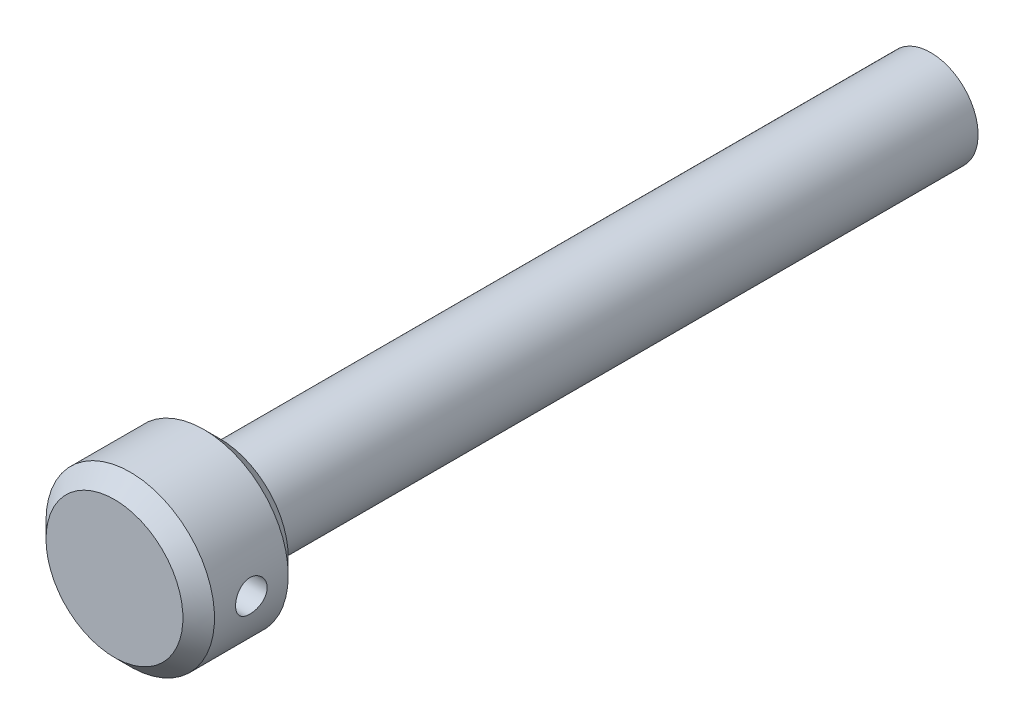
ISO-10303-21;
HEADER;
FILE_DESCRIPTION(('STEP AP214'),'2;1');
FILE_NAME('part.step','',(''),(''),'','','');
FILE_SCHEMA(('AUTOMOTIVE_DESIGN { 1 0 10303 214 1 1 1 1 }'));
ENDSEC;
DATA;
#1=APPLICATION_CONTEXT('core data for automotive mechanical design processes');
#2=APPLICATION_PROTOCOL_DEFINITION('international standard','automotive_design',2000,#1);
#3=PRODUCT_CONTEXT('',#1,'mechanical');
#4=PRODUCT('Part','Part','',(#3));
#5=PRODUCT_RELATED_PRODUCT_CATEGORY('part','',(#4));
#6=PRODUCT_DEFINITION_FORMATION('','',#4);
#7=PRODUCT_DEFINITION_CONTEXT('part definition',#1,'design');
#8=PRODUCT_DEFINITION('design','',#6,#7);
#9=PRODUCT_DEFINITION_SHAPE('','',#8);
#10=(LENGTH_UNIT() NAMED_UNIT(*) SI_UNIT(.MILLI.,.METRE.));
#11=(NAMED_UNIT(*) PLANE_ANGLE_UNIT() SI_UNIT($,.RADIAN.));
#12=(NAMED_UNIT(*) SI_UNIT($,.STERADIAN.) SOLID_ANGLE_UNIT());
#13=UNCERTAINTY_MEASURE_WITH_UNIT(LENGTH_MEASURE(1.E-05),#10,'distance_accuracy_value','');
#14=(GEOMETRIC_REPRESENTATION_CONTEXT(3) GLOBAL_UNCERTAINTY_ASSIGNED_CONTEXT((#13)) GLOBAL_UNIT_ASSIGNED_CONTEXT((#10,
#11,#12)) REPRESENTATION_CONTEXT('',''));
#15=CARTESIAN_POINT('',(0.,0.,0.));
#16=DIRECTION('',(0.,0.,1.));
#17=DIRECTION('',(1.,0.,0.));
#18=AXIS2_PLACEMENT_3D('',#15,#16,#17);
#19=CARTESIAN_POINT('',(-35.6874973721951,19.9803467794166,20.));
#20=DIRECTION('',(0.,0.,-1.));
#21=DIRECTION('',(-1.,0.,0.));
#22=AXIS2_PLACEMENT_3D('',#19,#20,#21);
#23=CYLINDRICAL_SURFACE('',#22,16.);
#24=CARTESIAN_POINT('',(-19.6874973721951,19.9803467794166,7.));
#25=CARTESIAN_POINT('',(-19.6875003955181,19.8134032864857,7.00000637917655));
#26=CARTESIAN_POINT('',(-19.6901371737608,19.6463767939564,7.01398215323876));
#27=CARTESIAN_POINT('',(-19.7004016543847,19.317030519733,7.06947999023669));
#28=CARTESIAN_POINT('',(-19.7080335688572,19.1547148311121,7.11102530127947));
#29=CARTESIAN_POINT('',(-19.7274345968859,18.839600855713,7.22034540251868));
#30=CARTESIAN_POINT('',(-19.7391999732654,18.6867941180459,7.28809650490509));
#31=CARTESIAN_POINT('',(-19.7655831601994,18.3947308332286,7.44783775384563));
#32=CARTESIAN_POINT('',(-19.7802007398293,18.255473190462,7.53982593828964));
#33=CARTESIAN_POINT('',(-19.810870643585,17.9927793475556,7.74659953600735));
#34=CARTESIAN_POINT('',(-19.8269366750681,17.8695288693529,7.86161888934027));
#35=CARTESIAN_POINT('',(-19.8585910030221,17.6439546567092,8.11068661817512));
#36=CARTESIAN_POINT('',(-19.8741792651046,17.5416324256318,8.24473635953857));
#37=CARTESIAN_POINT('',(-19.903246347295,17.3600468061007,8.52937217672794));
#38=CARTESIAN_POINT('',(-19.9167074944715,17.2809723400245,8.68008074063447));
#39=CARTESIAN_POINT('',(-19.9398031079554,17.1493362927709,8.99293783035358));
#40=CARTESIAN_POINT('',(-19.9494379042559,17.0967724251546,9.15508536822243));
#41=CARTESIAN_POINT('',(-19.9636519807041,17.0202457093466,9.48423046182882));
#42=CARTESIAN_POINT('',(-19.968288464867,16.9959589755758,9.65115019440693));
#43=CARTESIAN_POINT('',(-19.9721534291399,16.9756706175097,9.98675476961649));
#44=CARTESIAN_POINT('',(-19.9713823942199,16.9796664567091,10.1554394526046));
#45=CARTESIAN_POINT('',(-19.96457151816,17.0155671873693,10.4874390505321));
#46=CARTESIAN_POINT('',(-19.9586012092484,17.0471037794957,10.6507954286003));
#47=CARTESIAN_POINT('',(-19.9421737065018,17.1366107914925,10.9698568395652));
#48=CARTESIAN_POINT('',(-19.9317163220048,17.1945823346266,11.1255615470186));
#49=CARTESIAN_POINT('',(-19.9074202663433,17.3356738358306,11.4259773580005));
#50=CARTESIAN_POINT('',(-19.8935616957278,17.4189425087675,11.5706169411616));
#51=CARTESIAN_POINT('',(-19.8640379401367,17.6081594008083,11.8440094570805));
#52=CARTESIAN_POINT('',(-19.8483725718847,17.7141099216313,11.9727607754296));
#53=CARTESIAN_POINT('',(-19.8166973467518,17.9476686657106,12.2128499113449));
#54=CARTESIAN_POINT('',(-19.8006859517145,18.0755919056952,12.3238813049035));
#55=CARTESIAN_POINT('',(-19.7703496500287,18.3484107052189,12.5229544813508));
#56=CARTESIAN_POINT('',(-19.7560247602902,18.4933064349051,12.6109960337408));
#57=CARTESIAN_POINT('',(-19.7306465786449,18.7962768016673,12.76163550774));
#58=CARTESIAN_POINT('',(-19.7195973894693,18.9543676505236,12.8242015582358));
#59=CARTESIAN_POINT('',(-19.7020472641407,19.2790685486192,12.9218041861843));
#60=CARTESIAN_POINT('',(-19.6955458448352,19.445677690861,12.9568436880907));
#61=CARTESIAN_POINT('',(-19.6878901593555,19.7800494736098,12.9979720620365));
#62=CARTESIAN_POINT('',(-19.6866583539495,19.9477587541483,13.0044807830595));
#63=CARTESIAN_POINT('',(-19.6894665002305,20.281869275601,12.9894890409047));
#64=CARTESIAN_POINT('',(-19.6935061929065,20.4482705803774,12.9679899538695));
#65=CARTESIAN_POINT('',(-19.706355142187,20.773709925853,12.8979419296333));
#66=CARTESIAN_POINT('',(-19.7151269247145,20.9327953015087,12.8496054349244));
#67=CARTESIAN_POINT('',(-19.7364605279451,21.2406040430659,12.7274845864424));
#68=CARTESIAN_POINT('',(-19.7490226059684,21.3893267046068,12.6536985048684));
#69=CARTESIAN_POINT('',(-19.7767367650418,21.673980122443,12.481843743681));
#70=CARTESIAN_POINT('',(-19.7919156487038,21.8097533334468,12.3835185229263));
#71=CARTESIAN_POINT('',(-19.8231105024009,22.0630234259457,12.1657237252753));
#72=CARTESIAN_POINT('',(-19.8391265505014,22.1805185989383,12.0462521739973));
#73=CARTESIAN_POINT('',(-19.8704478582461,22.3954926968576,11.7876553621771));
#74=CARTESIAN_POINT('',(-19.88574085499,22.4926851037881,11.6482901837492));
#75=CARTESIAN_POINT('',(-19.9136376606245,22.6622802805723,11.3549647509525));
#76=CARTESIAN_POINT('',(-19.9262415694481,22.7346839716951,11.2010050392591));
#77=CARTESIAN_POINT('',(-19.9472368880036,22.8522402496731,10.8835882655149));
#78=CARTESIAN_POINT('',(-19.9556485634575,22.8975241553123,10.7201812408813));
#79=CARTESIAN_POINT('',(-19.9673532961468,22.9599603659413,10.3879055549572));
#80=CARTESIAN_POINT('',(-19.9706469308793,22.9771158448308,10.2190375120592));
#81=CARTESIAN_POINT('',(-19.971713376118,22.9827020223837,9.88350333711698));
#82=CARTESIAN_POINT('',(-19.9695730527092,22.9715846794866,9.71684483808601));
#83=CARTESIAN_POINT('',(-19.9602053589951,22.9219302869927,9.38781715590942));
#84=CARTESIAN_POINT('',(-19.9529780190802,22.8833934012032,9.22544794714512));
#85=CARTESIAN_POINT('',(-19.9342872117315,22.7801845310819,8.90985103040904));
#86=CARTESIAN_POINT('',(-19.9228316802958,22.7155614873616,8.75660681730847));
#87=CARTESIAN_POINT('',(-19.8969696211583,22.5620641576607,8.46306349151832));
#88=CARTESIAN_POINT('',(-19.8825628849927,22.4731881583803,8.32276529431044));
#89=CARTESIAN_POINT('',(-19.8521520500402,22.2721365262073,8.05683263991541));
#90=CARTESIAN_POINT('',(-19.8361272651342,22.1596319767027,7.9314491748658));
#91=CARTESIAN_POINT('',(-19.8044406938204,21.9152026329012,7.70118967507096));
#92=CARTESIAN_POINT('',(-19.7887789916485,21.7832733831998,7.59631835803973));
#93=CARTESIAN_POINT('',(-19.7594178528341,21.5023166695603,7.40917809474588));
#94=CARTESIAN_POINT('',(-19.7457373523839,21.3531459606976,7.32712114301872));
#95=CARTESIAN_POINT('',(-19.7220649845814,21.0429270067243,7.18936472678973));
#96=CARTESIAN_POINT('',(-19.7120696546144,20.8818900828271,7.13364050590619));
#97=CARTESIAN_POINT('',(-19.6989315580425,20.5970411850669,7.06144537116265));
#98=CARTESIAN_POINT('',(-19.694667954631,20.4748943999203,7.0384427393744));
#99=CARTESIAN_POINT('',(-19.6889497731149,20.2286292736469,7.00771787576711));
#100=CARTESIAN_POINT('',(-19.687495123599,20.104510982722,6.99999525548819));
#101=CARTESIAN_POINT('',(-19.6874973721951,19.9803467794166,7.));
#102=B_SPLINE_CURVE_WITH_KNOTS('',3,(#24,#25,#26,#27,#28,#29,#30,#31,#32,#33,#34,#35,#36,#37,
#38,#39,#40,#41,#42,#43,#44,#45,#46,#47,#48,#49,#50,#51,#52,#53,#54,#55,#56,#57,#58,#59,#60,#61,
#62,#63,#64,#65,#66,#67,#68,#69,#70,#71,#72,#73,#74,#75,#76,#77,#78,#79,#80,#81,#82,#83,#84,#85,
#86,#87,#88,#89,#90,#91,#92,#93,#94,#95,#96,#97,#98,#99,#100,#101),.UNSPECIFIED.,.T.,.F.,(4,2,2,
2,2,2,2,2,2,2,2,2,2,2,2,2,2,2,2,2,2,2,2,2,2,2,2,2,2,2,2,2,2,2,2,2,2,2,4),(0.,0.500376401929849,
1.0011752850709,1.50152254246181,2.00182930673781,2.5075023602726,3.01321172567233,
3.52292381008715,4.03259192623897,4.53636302890671,5.04008895174511,5.53718001225531,
6.03429219693573,6.53438525259061,7.03452908099718,7.54255536928153,8.05058675089895,
8.55925176643396,9.0678627334749,9.56896348152192,10.0700396092917,10.5672046781566,
11.0644035067606,11.5670355603542,12.069714568262,12.579068739746,13.0884039790989,
13.5952525563712,14.1020439389302,14.600785044635,15.0995231708301,15.5973299241538,
16.0951718531085,16.6004673993276,17.1058790252451,17.6158409783263,18.1253225386235,
18.4974868904882,18.8696417807908),.UNSPECIFIED.);
#103=CARTESIAN_POINT('',(-19.6874973721951,19.9803467794166,7.));
#104=VERTEX_POINT('',#103);
#105=EDGE_CURVE('E49',#104,#104,#102,.T.);
#106=ORIENTED_EDGE('',*,*,#105,.T.);
#107=EDGE_LOOP('',(#106));
#108=FACE_BOUND('',#107,.T.);
#109=CARTESIAN_POINT('',(-51.6874973721951,19.9803467794166,7.));
#110=CARTESIAN_POINT('',(-51.6874943488721,20.1472902723475,7.00000637917655));
#111=CARTESIAN_POINT('',(-51.6848575706294,20.3143167648768,7.01398215323876));
#112=CARTESIAN_POINT('',(-51.6745930900055,20.6436630391002,7.06947999023669));
#113=CARTESIAN_POINT('',(-51.666961175533,20.805978727721,7.11102530127947));
#114=CARTESIAN_POINT('',(-51.6475601475043,21.1210927031202,7.22034540251868));
#115=CARTESIAN_POINT('',(-51.6357947711248,21.2738994407873,7.28809650490509));
#116=CARTESIAN_POINT('',(-51.6094115841908,21.5659627256046,7.44783775384563));
#117=CARTESIAN_POINT('',(-51.5947940045609,21.7052203683712,7.53982593828963));
#118=CARTESIAN_POINT('',(-51.5641241008052,21.9679142112776,7.74659953600735));
#119=CARTESIAN_POINT('',(-51.5480580693221,22.0911646894803,7.86161888934027));
#120=CARTESIAN_POINT('',(-51.5164037413681,22.316738902124,8.11068661817512));
#121=CARTESIAN_POINT('',(-51.5008154792856,22.4190611332014,8.24473635953857));
#122=CARTESIAN_POINT('',(-51.4717483970952,22.6006467527325,8.52937217672794));
#123=CARTESIAN_POINT('',(-51.4582872499187,22.6797212188087,8.68008074063447));
#124=CARTESIAN_POINT('',(-51.4351916364348,22.8113572660623,8.99293783035358));
#125=CARTESIAN_POINT('',(-51.4255568401343,22.8639211336786,9.15508536822243));
#126=CARTESIAN_POINT('',(-51.4113427636861,22.9404478494866,9.48423046182882));
#127=CARTESIAN_POINT('',(-51.4067062795232,22.9647345832574,9.65115019440693));
#128=CARTESIAN_POINT('',(-51.4028413152503,22.9850229413235,9.98675476961649));
#129=CARTESIAN_POINT('',(-51.4036123501703,22.9810271021241,10.1554394526046));
#130=CARTESIAN_POINT('',(-51.4104232262302,22.9451263714638,10.4874390505321));
#131=CARTESIAN_POINT('',(-51.4163935351418,22.9135897793375,10.6507954286003));
#132=CARTESIAN_POINT('',(-51.4328210378884,22.8240827673407,10.9698568395652));
#133=CARTESIAN_POINT('',(-51.4432784223854,22.7661112242066,11.1255615470186));
#134=CARTESIAN_POINT('',(-51.4675744780469,22.6250197230026,11.4259773580005));
#135=CARTESIAN_POINT('',(-51.4814330486624,22.5417510500657,11.5706169411616));
#136=CARTESIAN_POINT('',(-51.5109568042535,22.3525341580249,11.8440094570805));
#137=CARTESIAN_POINT('',(-51.5266221725055,22.2465836372019,11.9727607754296));
#138=CARTESIAN_POINT('',(-51.5582973976384,22.0130248931226,12.2128499113449));
#139=CARTESIAN_POINT('',(-51.5743087926757,21.885101653138,12.3238813049035));
#140=CARTESIAN_POINT('',(-51.6046450943615,21.6122828536142,12.5229544813508));
#141=CARTESIAN_POINT('',(-51.6189699841,21.4673871239281,12.6109960337408));
#142=CARTESIAN_POINT('',(-51.6443481657453,21.1644167571659,12.76163550774));
#143=CARTESIAN_POINT('',(-51.6553973549209,21.0063259083096,12.8242015582358));
#144=CARTESIAN_POINT('',(-51.6729474802495,20.681625010214,12.9218041861843));
#145=CARTESIAN_POINT('',(-51.679448899555,20.5150158679722,12.9568436880907));
#146=CARTESIAN_POINT('',(-51.6871045850347,20.1806440852234,12.9979720620365));
#147=CARTESIAN_POINT('',(-51.6883363904407,20.0129348046849,13.0044807830595));
#148=CARTESIAN_POINT('',(-51.6855282441597,19.6788242832322,12.9894890409047));
#149=CARTESIAN_POINT('',(-51.6814885514837,19.5124229784558,12.9679899538695));
#150=CARTESIAN_POINT('',(-51.6686396022032,19.1869836329802,12.8979419296333));
#151=CARTESIAN_POINT('',(-51.6598678196757,19.0278982573245,12.8496054349244));
#152=CARTESIAN_POINT('',(-51.6385342164451,18.7200895157673,12.7274845864424));
#153=CARTESIAN_POINT('',(-51.6259721384218,18.5713668542264,12.6536985048684));
#154=CARTESIAN_POINT('',(-51.5982579793484,18.2867134363902,12.481843743681));
#155=CARTESIAN_POINT('',(-51.5830790956864,18.1509402253864,12.3835185229263));
#156=CARTESIAN_POINT('',(-51.5518842419893,17.8976701328875,12.1657237252753));
#157=CARTESIAN_POINT('',(-51.5358681938888,17.7801749598949,12.0462521739973));
#158=CARTESIAN_POINT('',(-51.5045468861441,17.5652008619756,11.7876553621771));
#159=CARTESIAN_POINT('',(-51.4892538894002,17.4680084550451,11.6482901837492));
#160=CARTESIAN_POINT('',(-51.4613570837657,17.2984132782609,11.3549647509525));
#161=CARTESIAN_POINT('',(-51.4487531749421,17.2260095871381,11.2010050392591));
#162=CARTESIAN_POINT('',(-51.4277578563866,17.1084533091601,10.8835882655149));
#163=CARTESIAN_POINT('',(-51.4193461809327,17.0631694035209,10.7201812408813));
#164=CARTESIAN_POINT('',(-51.4076414482434,17.0007331928919,10.3879055549572));
#165=CARTESIAN_POINT('',(-51.4043478135109,16.9835777140024,10.2190375120592));
#166=CARTESIAN_POINT('',(-51.4032813682722,16.9779915364495,9.88350333711698));
#167=CARTESIAN_POINT('',(-51.405421691681,16.9891088793466,9.71684483808601));
#168=CARTESIAN_POINT('',(-51.4147893853951,17.0387632718405,9.38781715590943));
#169=CARTESIAN_POINT('',(-51.42201672531,17.07730015763,9.22544794714512));
#170=CARTESIAN_POINT('',(-51.4407075326587,17.1805090277513,8.90985103040904));
#171=CARTESIAN_POINT('',(-51.4521630640944,17.2451320714715,8.75660681730847));
#172=CARTESIAN_POINT('',(-51.4780251232319,17.3986294011725,8.46306349151832));
#173=CARTESIAN_POINT('',(-51.4924318593975,17.4875054004529,8.32276529431044));
#174=CARTESIAN_POINT('',(-51.52284269435,17.6885570326259,8.05683263991542));
#175=CARTESIAN_POINT('',(-51.538867479256,17.8010615821305,7.9314491748658));
#176=CARTESIAN_POINT('',(-51.5705540505698,18.045490925932,7.70118967507096));
#177=CARTESIAN_POINT('',(-51.5862157527417,18.1774201756334,7.59631835803973));
#178=CARTESIAN_POINT('',(-51.6155768915561,18.4583768892728,7.40917809474588));
#179=CARTESIAN_POINT('',(-51.6292573920063,18.6075475981356,7.32712114301872));
#180=CARTESIAN_POINT('',(-51.6529297598088,18.9177665521089,7.18936472678973));
#181=CARTESIAN_POINT('',(-51.6629250897758,19.0788034760061,7.13364050590618));
#182=CARTESIAN_POINT('',(-51.6760631863477,19.3636523737663,7.06144537116265));
#183=CARTESIAN_POINT('',(-51.6803267897592,19.4857991589129,7.0384427393744));
#184=CARTESIAN_POINT('',(-51.6860449712753,19.7320642851863,7.00771787576711));
#185=CARTESIAN_POINT('',(-51.6874996207912,19.8561825761112,6.99999525548819));
#186=CARTESIAN_POINT('',(-51.6874973721951,19.9803467794166,7.));
#187=B_SPLINE_CURVE_WITH_KNOTS('',3,(#109,#110,#111,#112,#113,#114,#115,#116,#117,#118,#119,
#120,#121,#122,#123,#124,#125,#126,#127,#128,#129,#130,#131,#132,#133,#134,#135,#136,#137,#138,
#139,#140,#141,#142,#143,#144,#145,#146,#147,#148,#149,#150,#151,#152,#153,#154,#155,#156,#157,
#158,#159,#160,#161,#162,#163,#164,#165,#166,#167,#168,#169,#170,#171,#172,#173,#174,#175,#176,
#177,#178,#179,#180,#181,#182,#183,#184,#185,#186),.UNSPECIFIED.,.T.,.F.,(4,2,2,2,2,2,2,2,2,2,2,
2,2,2,2,2,2,2,2,2,2,2,2,2,2,2,2,2,2,2,2,2,2,2,2,2,2,2,4),(0.,0.500376401929849,1.0011752850709,
1.50152254246181,2.00182930673781,2.5075023602726,3.01321172567233,3.52292381008714,
4.03259192623896,4.53636302890671,5.04008895174511,5.5371800122553,6.03429219693572,
6.5343852525906,7.03452908099718,7.54255536928153,8.05058675089895,8.55925176643396,
9.0678627334749,9.56896348152192,10.0700396092917,10.5672046781566,11.0644035067606,
11.5670355603542,12.069714568262,12.579068739746,13.0884039790989,13.5952525563712,
14.1020439389302,14.600785044635,15.0995231708301,15.5973299241538,16.0951718531084,
16.6004673993276,17.1058790252451,17.6158409783263,18.1253225386235,18.4974868904882,
18.8696417807908),.UNSPECIFIED.);
#188=CARTESIAN_POINT('',(-51.6874973721951,19.9803467794166,7.));
#189=VERTEX_POINT('',#188);
#190=EDGE_CURVE('E10',#189,#189,#187,.T.);
#191=ORIENTED_EDGE('',*,*,#190,.T.);
#192=EDGE_LOOP('',(#191));
#193=FACE_BOUND('',#192,.T.);
#194=CARTESIAN_POINT('',(-35.6874973721951,19.9803467794166,3.00000000000001));
#195=DIRECTION('',(0.,0.,1.));
#196=DIRECTION('',(1.,0.,0.));
#197=AXIS2_PLACEMENT_3D('',#194,#195,#196);
#198=CIRCLE('',#197,16.);
#199=CARTESIAN_POINT('',(-19.6874973721951,19.9803467794166,3.00000000000001));
#200=VERTEX_POINT('',#199);
#201=EDGE_CURVE('E111',#200,#200,#198,.T.);
#202=ORIENTED_EDGE('',*,*,#201,.T.);
#203=EDGE_LOOP('',(#202));
#204=FACE_BOUND('',#203,.T.);
#205=CARTESIAN_POINT('',(-35.6874973721951,19.9803467794166,17.));
#206=DIRECTION('',(0.,0.,1.));
#207=DIRECTION('',(1.,0.,0.));
#208=AXIS2_PLACEMENT_3D('',#205,#206,#207);
#209=CIRCLE('',#208,16.);
#210=CARTESIAN_POINT('',(-51.6874973721951,19.9803467794166,17.));
#211=VERTEX_POINT('',#210);
#212=EDGE_CURVE('E114',#211,#211,#209,.F.);
#213=ORIENTED_EDGE('',*,*,#212,.T.);
#214=EDGE_LOOP('',(#213));
#215=FACE_BOUND('',#214,.T.);
#216=ADVANCED_FACE('F44',(#108,#193,#204,#215),#23,.T.);
#217=CARTESIAN_POINT('',(-35.6874973721951,19.9803467794166,20.));
#218=DIRECTION('',(0.,0.,1.));
#219=DIRECTION('',(1.,0.,0.));
#220=AXIS2_PLACEMENT_3D('',#217,#218,#219);
#221=PLANE('',#220);
#222=CARTESIAN_POINT('',(-35.6874973721951,19.9803467794166,20.));
#223=DIRECTION('',(0.,0.,1.));
#224=DIRECTION('',(1.,0.,0.));
#225=AXIS2_PLACEMENT_3D('',#222,#223,#224);
#226=CIRCLE('',#225,13.);
#227=CARTESIAN_POINT('',(-48.6874973721951,19.9803467794166,20.));
#228=VERTEX_POINT('',#227);
#229=EDGE_CURVE('E116',#228,#228,#226,.T.);
#230=ORIENTED_EDGE('',*,*,#229,.T.);
#231=EDGE_LOOP('',(#230));
#232=FACE_BOUND('',#231,.T.);
#233=ADVANCED_FACE('F87',(#232),#221,.T.);
#234=CARTESIAN_POINT('',(-35.6874973721951,19.9803467794166,0.));
#235=DIRECTION('',(0.,0.,1.));
#236=DIRECTION('',(1.,0.,0.));
#237=AXIS2_PLACEMENT_3D('',#234,#235,#236);
#238=PLANE('',#237);
#239=CARTESIAN_POINT('',(-35.6874973721951,19.9803467794166,0.));
#240=DIRECTION('',(0.,0.,-1.));
#241=DIRECTION('',(-1.,0.,0.));
#242=AXIS2_PLACEMENT_3D('',#239,#240,#241);
#243=CIRCLE('',#242,9.);
#244=CARTESIAN_POINT('',(-44.6874973721951,19.9803467794166,0.));
#245=VERTEX_POINT('',#244);
#246=EDGE_CURVE('E59',#245,#245,#243,.T.);
#247=ORIENTED_EDGE('',*,*,#246,.F.);
#248=EDGE_LOOP('',(#247));
#249=FACE_BOUND('',#248,.T.);
#250=CARTESIAN_POINT('',(-35.6874973721951,19.9803467794166,0.));
#251=DIRECTION('',(0.,0.,1.));
#252=DIRECTION('',(1.,0.,0.));
#253=AXIS2_PLACEMENT_3D('',#250,#251,#252);
#254=CIRCLE('',#253,13.);
#255=CARTESIAN_POINT('',(-22.6874973721951,19.9803467794166,0.));
#256=VERTEX_POINT('',#255);
#257=EDGE_CURVE('E64',#256,#256,#254,.F.);
#258=ORIENTED_EDGE('',*,*,#257,.T.);
#259=EDGE_LOOP('',(#258));
#260=FACE_BOUND('',#259,.T.);
#261=ADVANCED_FACE('F89',(#249,#260),#238,.F.);
#262=CARTESIAN_POINT('',(-35.6874973721951,19.9803467794166,20.));
#263=DIRECTION('',(0.,0.,-1.));
#264=DIRECTION('',(-1.,0.,0.));
#265=AXIS2_PLACEMENT_3D('',#262,#263,#264);
#266=CONICAL_SURFACE('',#265,13.,0.785398163397446);
#267=CARTESIAN_POINT('',(-51.6874973721951,19.9803467794166,17.));
#268=CARTESIAN_POINT('',(-51.6562473721951,19.9803467794166,17.03125));
#269=CARTESIAN_POINT('',(-51.6249973721951,19.9803467794166,17.0625));
#270=CARTESIAN_POINT('',(-51.5624973721951,19.9803467794166,17.125));
#271=CARTESIAN_POINT('',(-51.5312473721951,19.9803467794166,17.15625));
#272=CARTESIAN_POINT('',(-51.4687473721951,19.9803467794166,17.21875));
#273=CARTESIAN_POINT('',(-51.4374973721951,19.9803467794166,17.25));
#274=CARTESIAN_POINT('',(-51.3749973721951,19.9803467794166,17.3125));
#275=CARTESIAN_POINT('',(-51.3437473721951,19.9803467794166,17.34375));
#276=CARTESIAN_POINT('',(-51.2812473721951,19.9803467794166,17.40625));
#277=CARTESIAN_POINT('',(-51.2499973721951,19.9803467794166,17.4375));
#278=CARTESIAN_POINT('',(-51.1874973721951,19.9803467794166,17.5));
#279=CARTESIAN_POINT('',(-51.1562473721951,19.9803467794166,17.53125));
#280=CARTESIAN_POINT('',(-51.0937473721951,19.9803467794166,17.59375));
#281=CARTESIAN_POINT('',(-51.0624973721951,19.9803467794166,17.625));
#282=CARTESIAN_POINT('',(-50.9999973721951,19.9803467794166,17.6875));
#283=CARTESIAN_POINT('',(-50.9687473721951,19.9803467794166,17.71875));
#284=CARTESIAN_POINT('',(-50.9062473721951,19.9803467794166,17.78125));
#285=CARTESIAN_POINT('',(-50.8749973721951,19.9803467794166,17.8125));
#286=CARTESIAN_POINT('',(-50.8124973721951,19.9803467794166,17.875));
#287=CARTESIAN_POINT('',(-50.7812473721951,19.9803467794166,17.90625));
#288=CARTESIAN_POINT('',(-50.7187473721951,19.9803467794166,17.96875));
#289=CARTESIAN_POINT('',(-50.6874973721951,19.9803467794166,18.));
#290=CARTESIAN_POINT('',(-50.6249973721951,19.9803467794166,18.0625));
#291=CARTESIAN_POINT('',(-50.5937473721951,19.9803467794166,18.09375));
#292=CARTESIAN_POINT('',(-50.5312473721951,19.9803467794166,18.15625));
#293=CARTESIAN_POINT('',(-50.4999973721951,19.9803467794166,18.1875));
#294=CARTESIAN_POINT('',(-50.4374973721951,19.9803467794166,18.25));
#295=CARTESIAN_POINT('',(-50.4062473721951,19.9803467794166,18.28125));
#296=CARTESIAN_POINT('',(-50.3437473721951,19.9803467794166,18.34375));
#297=CARTESIAN_POINT('',(-50.3124973721951,19.9803467794166,18.375));
#298=CARTESIAN_POINT('',(-50.2499973721951,19.9803467794166,18.4375));
#299=CARTESIAN_POINT('',(-50.2187473721951,19.9803467794166,18.46875));
#300=CARTESIAN_POINT('',(-50.1562473721951,19.9803467794166,18.53125));
#301=CARTESIAN_POINT('',(-50.1249973721951,19.9803467794166,18.5625));
#302=CARTESIAN_POINT('',(-50.0624973721951,19.9803467794166,18.625));
#303=CARTESIAN_POINT('',(-50.0312473721951,19.9803467794166,18.65625));
#304=CARTESIAN_POINT('',(-49.9687473721951,19.9803467794166,18.71875));
#305=CARTESIAN_POINT('',(-49.9374973721951,19.9803467794166,18.75));
#306=CARTESIAN_POINT('',(-49.8749973721951,19.9803467794166,18.8125));
#307=CARTESIAN_POINT('',(-49.8437473721951,19.9803467794166,18.84375));
#308=CARTESIAN_POINT('',(-49.7812473721951,19.9803467794166,18.90625));
#309=CARTESIAN_POINT('',(-49.7499973721951,19.9803467794166,18.9375));
#310=CARTESIAN_POINT('',(-49.6874973721951,19.9803467794166,19.));
#311=CARTESIAN_POINT('',(-49.6562473721951,19.9803467794166,19.03125));
#312=CARTESIAN_POINT('',(-49.5937473721951,19.9803467794166,19.09375));
#313=CARTESIAN_POINT('',(-49.5624973721951,19.9803467794166,19.125));
#314=CARTESIAN_POINT('',(-49.4999973721951,19.9803467794166,19.1875));
#315=CARTESIAN_POINT('',(-49.4687473721951,19.9803467794166,19.21875));
#316=CARTESIAN_POINT('',(-49.4062473721951,19.9803467794166,19.28125));
#317=CARTESIAN_POINT('',(-49.3749973721951,19.9803467794166,19.3125));
#318=CARTESIAN_POINT('',(-49.3124973721951,19.9803467794166,19.375));
#319=CARTESIAN_POINT('',(-49.2812473721951,19.9803467794166,19.40625));
#320=CARTESIAN_POINT('',(-49.2187473721951,19.9803467794166,19.46875));
#321=CARTESIAN_POINT('',(-49.1874973721951,19.9803467794166,19.5));
#322=CARTESIAN_POINT('',(-49.1249973721951,19.9803467794166,19.5625));
#323=CARTESIAN_POINT('',(-49.0937473721951,19.9803467794166,19.59375));
#324=CARTESIAN_POINT('',(-49.0312473721951,19.9803467794166,19.65625));
#325=CARTESIAN_POINT('',(-48.9999973721951,19.9803467794166,19.6875));
#326=CARTESIAN_POINT('',(-48.9374973721951,19.9803467794166,19.75));
#327=CARTESIAN_POINT('',(-48.9062473721951,19.9803467794166,19.78125));
#328=CARTESIAN_POINT('',(-48.8437473721951,19.9803467794166,19.84375));
#329=CARTESIAN_POINT('',(-48.8124973721951,19.9803467794166,19.875));
#330=CARTESIAN_POINT('',(-48.7499973721951,19.9803467794166,19.9375));
#331=CARTESIAN_POINT('',(-48.7187473721951,19.9803467794166,19.96875));
#332=CARTESIAN_POINT('',(-48.6874973721951,19.9803467794166,20.));
#333=B_SPLINE_CURVE_WITH_KNOTS('',3,(#267,#268,#269,#270,#271,#272,#273,#274,#275,#276,#277,
#278,#279,#280,#281,#282,#283,#284,#285,#286,#287,#288,#289,#290,#291,#292,#293,#294,#295,#296,
#297,#298,#299,#300,#301,#302,#303,#304,#305,#306,#307,#308,#309,#310,#311,#312,#313,#314,#315,
#316,#317,#318,#319,#320,#321,#322,#323,#324,#325,#326,#327,#328,#329,#330,#331,#332),
.UNSPECIFIED.,.F.,.F.,(4,2,2,2,2,2,2,2,2,2,2,2,2,2,2,2,2,2,2,2,2,2,2,2,2,2,2,2,2,2,2,2,4),(0.,
0.132582521472475,0.265165042944958,0.397747564417436,0.530330085889913,0.662912607362389,
0.795495128834869,0.928077650307344,1.06066017177982,1.1932426932523,1.32582521472478,
1.45840773619726,1.59099025766973,1.72357277914221,1.85615530061469,1.98873782208717,
2.12132034355964,2.25390286503212,2.3864853865046,2.51906790797708,2.65165042944955,
2.78423295092203,2.91681547239451,3.04939799386698,3.18198051533946,3.31456303681194,
3.44714555828442,3.5797280797569,3.71231060122938,3.84489312270186,3.97747564417433,
4.11005816564681,4.24264068711929),.UNSPECIFIED.);
#334=EDGE_CURVE('BSEAM92',#211,#228,#333,.T.);
#335=ORIENTED_EDGE('',*,*,#212,.F.);
#336=ORIENTED_EDGE('',*,*,#229,.F.);
#337=ORIENTED_EDGE('',*,*,#334,.T.);
#338=ORIENTED_EDGE('',*,*,#334,.F.);
#339=EDGE_LOOP('',(#335,#337,#336,#338));
#340=FACE_BOUND('',#339,.T.);
#341=ADVANCED_FACE('F92',(#340),#266,.T.);
#342=CARTESIAN_POINT('',(-35.6874973721951,19.9803467794166,3.00000000000001));
#343=DIRECTION('',(0.,0.,1.));
#344=DIRECTION('',(1.,0.,0.));
#345=AXIS2_PLACEMENT_3D('',#342,#343,#344);
#346=CONICAL_SURFACE('',#345,16.,0.78539816339745);
#347=ORIENTED_EDGE('',*,*,#257,.F.);
#348=EDGE_LOOP('',(#347));
#349=FACE_BOUND('',#348,.T.);
#350=ORIENTED_EDGE('',*,*,#201,.F.);
#351=EDGE_LOOP('',(#350));
#352=FACE_BOUND('',#351,.T.);
#353=ADVANCED_FACE('F47',(#349,#352),#346,.T.);
#354=CARTESIAN_POINT('',(-35.6874973721951,19.9803467794166,-135.));
#355=DIRECTION('',(0.,0.,1.));
#356=DIRECTION('',(1.,0.,0.));
#357=AXIS2_PLACEMENT_3D('',#354,#355,#356);
#358=CYLINDRICAL_SURFACE('',#357,9.);
#359=CARTESIAN_POINT('',(-35.6874973721951,19.9803467794166,-135.));
#360=DIRECTION('',(0.,0.,-1.));
#361=DIRECTION('',(-1.,0.,0.));
#362=AXIS2_PLACEMENT_3D('',#359,#360,#361);
#363=CIRCLE('',#362,9.);
#364=CARTESIAN_POINT('',(-44.6874973721951,19.9803467794166,-135.));
#365=VERTEX_POINT('',#364);
#366=EDGE_CURVE('E121',#365,#365,#363,.T.);
#367=ORIENTED_EDGE('',*,*,#366,.F.);
#368=EDGE_LOOP('',(#367));
#369=FACE_BOUND('',#368,.T.);
#370=ORIENTED_EDGE('',*,*,#246,.T.);
#371=EDGE_LOOP('',(#370));
#372=FACE_BOUND('',#371,.T.);
#373=ADVANCED_FACE('F82',(#369,#372),#358,.T.);
#374=CARTESIAN_POINT('',(-35.6874973721951,19.9803467794166,-135.));
#375=DIRECTION('',(0.,0.,-1.));
#376=DIRECTION('',(-1.,0.,0.));
#377=AXIS2_PLACEMENT_3D('',#374,#375,#376);
#378=PLANE('',#377);
#379=ORIENTED_EDGE('',*,*,#366,.T.);
#380=EDGE_LOOP('',(#379));
#381=FACE_BOUND('',#380,.T.);
#382=ADVANCED_FACE('F77',(#381),#378,.T.);
#383=CARTESIAN_POINT('',(-51.6874973721951,19.9803467794166,10.));
#384=DIRECTION('',(1.,0.,0.));
#385=DIRECTION('',(0.,0.,-1.));
#386=AXIS2_PLACEMENT_3D('',#383,#384,#385);
#387=CYLINDRICAL_SURFACE('',#386,3.);
#388=ORIENTED_EDGE('',*,*,#105,.F.);
#389=EDGE_LOOP('',(#388));
#390=FACE_BOUND('',#389,.T.);
#391=ORIENTED_EDGE('',*,*,#190,.F.);
#392=EDGE_LOOP('',(#391));
#393=FACE_BOUND('',#392,.T.);
#394=ADVANCED_FACE('F73',(#390,#393),#387,.F.);
#395=CLOSED_SHELL('',(#216,#233,#261,#341,#353,#373,#382,#394));
#396=MANIFOLD_SOLID_BREP('B2',#395);
#397=ADVANCED_BREP_SHAPE_REPRESENTATION('',(#18,#396),#14);
#398=SHAPE_DEFINITION_REPRESENTATION(#9,#397);
ENDSEC;
END-ISO-10303-21;
